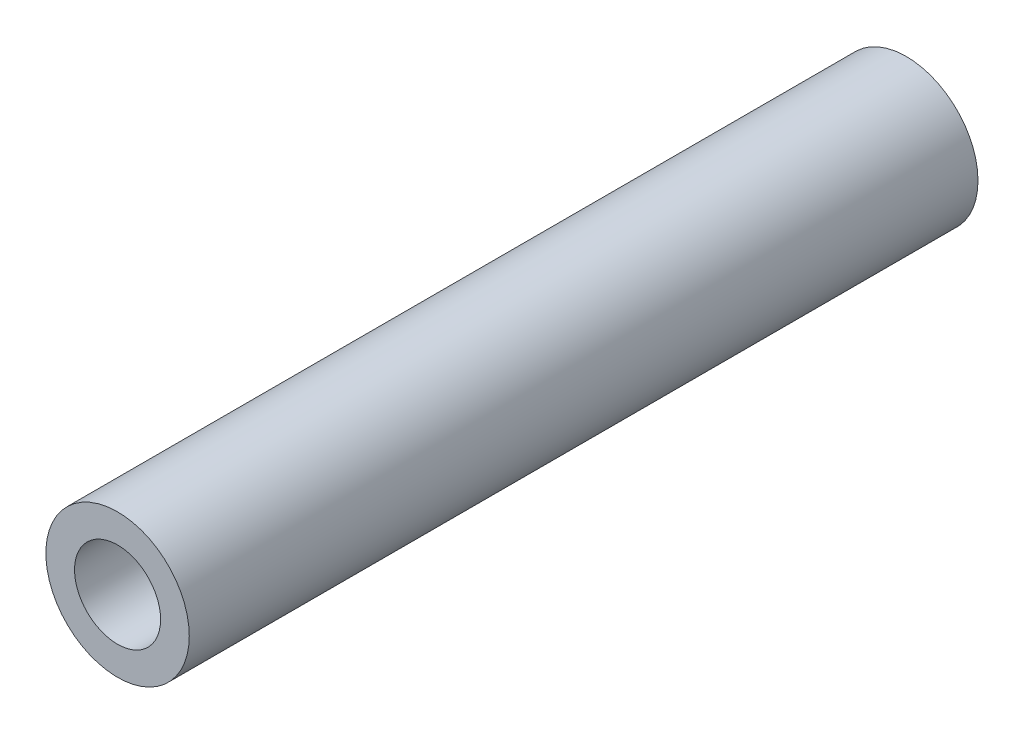
ISO-10303-21;
HEADER;
FILE_DESCRIPTION(('STEP AP214'),'2;1');
FILE_NAME('part.step','',(''),(''),'','','');
FILE_SCHEMA(('AUTOMOTIVE_DESIGN { 1 0 10303 214 1 1 1 1 }'));
ENDSEC;
DATA;
#1=APPLICATION_CONTEXT('core data for automotive mechanical design processes');
#2=APPLICATION_PROTOCOL_DEFINITION('international standard','automotive_design',2000,#1);
#3=PRODUCT_CONTEXT('',#1,'mechanical');
#4=PRODUCT('Part','Part','',(#3));
#5=PRODUCT_RELATED_PRODUCT_CATEGORY('part','',(#4));
#6=PRODUCT_DEFINITION_FORMATION('','',#4);
#7=PRODUCT_DEFINITION_CONTEXT('part definition',#1,'design');
#8=PRODUCT_DEFINITION('design','',#6,#7);
#9=PRODUCT_DEFINITION_SHAPE('','',#8);
#10=(LENGTH_UNIT() NAMED_UNIT(*) SI_UNIT(.MILLI.,.METRE.));
#11=(NAMED_UNIT(*) PLANE_ANGLE_UNIT() SI_UNIT($,.RADIAN.));
#12=(NAMED_UNIT(*) SI_UNIT($,.STERADIAN.) SOLID_ANGLE_UNIT());
#13=UNCERTAINTY_MEASURE_WITH_UNIT(LENGTH_MEASURE(1.E-05),#10,'distance_accuracy_value','');
#14=(GEOMETRIC_REPRESENTATION_CONTEXT(3) GLOBAL_UNCERTAINTY_ASSIGNED_CONTEXT((#13)) GLOBAL_UNIT_ASSIGNED_CONTEXT((#10,
#11,#12)) REPRESENTATION_CONTEXT('',''));
#15=CARTESIAN_POINT('',(0.,0.,0.));
#16=DIRECTION('',(0.,0.,1.));
#17=DIRECTION('',(1.,0.,0.));
#18=AXIS2_PLACEMENT_3D('',#15,#16,#17);
#19=CARTESIAN_POINT('',(0.,0.,-2.5));
#20=DIRECTION('',(0.,0.,1.));
#21=DIRECTION('',(1.,0.,0.));
#22=AXIS2_PLACEMENT_3D('',#19,#20,#21);
#23=CYLINDRICAL_SURFACE('',#22,2.5);
#24=CARTESIAN_POINT('',(0.,0.,-2.5));
#25=DIRECTION('',(0.,0.,1.));
#26=DIRECTION('',(1.,0.,0.));
#27=AXIS2_PLACEMENT_3D('',#24,#25,#26);
#28=CIRCLE('',#27,2.5);
#29=CARTESIAN_POINT('',(2.5,0.,-2.5));
#30=VERTEX_POINT('',#29);
#31=EDGE_CURVE('E10',#30,#30,#28,.T.);
#32=ORIENTED_EDGE('',*,*,#31,.T.);
#33=EDGE_LOOP('',(#32));
#34=FACE_BOUND('',#33,.T.);
#35=CARTESIAN_POINT('',(0.,0.,25.));
#36=DIRECTION('',(0.,0.,1.));
#37=DIRECTION('',(1.,0.,0.));
#38=AXIS2_PLACEMENT_3D('',#35,#36,#37);
#39=CIRCLE('',#38,2.5);
#40=CARTESIAN_POINT('',(2.5,0.,25.));
#41=VERTEX_POINT('',#40);
#42=EDGE_CURVE('E43',#41,#41,#39,.T.);
#43=ORIENTED_EDGE('',*,*,#42,.F.);
#44=EDGE_LOOP('',(#43));
#45=FACE_BOUND('',#44,.T.);
#46=ADVANCED_FACE('F37',(#34,#45),#23,.T.);
#47=CARTESIAN_POINT('',(0.,0.,-2.5));
#48=DIRECTION('',(0.,0.,1.));
#49=DIRECTION('',(1.,0.,0.));
#50=AXIS2_PLACEMENT_3D('',#47,#48,#49);
#51=PLANE('',#50);
#52=CARTESIAN_POINT('',(0.,0.,-2.5));
#53=DIRECTION('',(0.,0.,-1.));
#54=DIRECTION('',(-1.,0.,0.));
#55=AXIS2_PLACEMENT_3D('',#52,#53,#54);
#56=CIRCLE('',#55,1.5);
#57=CARTESIAN_POINT('',(-1.5,0.,-2.5));
#58=VERTEX_POINT('',#57);
#59=EDGE_CURVE('E51',#58,#58,#56,.T.);
#60=ORIENTED_EDGE('',*,*,#59,.F.);
#61=EDGE_LOOP('',(#60));
#62=FACE_BOUND('',#61,.T.);
#63=ORIENTED_EDGE('',*,*,#31,.F.);
#64=EDGE_LOOP('',(#63));
#65=FACE_BOUND('',#64,.T.);
#66=ADVANCED_FACE('F75',(#62,#65),#51,.F.);
#67=CARTESIAN_POINT('',(0.,0.,25.));
#68=DIRECTION('',(0.,0.,1.));
#69=DIRECTION('',(1.,0.,0.));
#70=AXIS2_PLACEMENT_3D('',#67,#68,#69);
#71=PLANE('',#70);
#72=CARTESIAN_POINT('',(0.,0.,25.));
#73=DIRECTION('',(0.,0.,1.));
#74=DIRECTION('',(1.,0.,0.));
#75=AXIS2_PLACEMENT_3D('',#72,#73,#74);
#76=CIRCLE('',#75,1.5);
#77=CARTESIAN_POINT('',(1.5,0.,25.));
#78=VERTEX_POINT('',#77);
#79=EDGE_CURVE('E57',#78,#78,#76,.T.);
#80=ORIENTED_EDGE('',*,*,#79,.F.);
#81=EDGE_LOOP('',(#80));
#82=FACE_BOUND('',#81,.T.);
#83=ORIENTED_EDGE('',*,*,#42,.T.);
#84=EDGE_LOOP('',(#83));
#85=FACE_BOUND('',#84,.T.);
#86=ADVANCED_FACE('F72',(#82,#85),#71,.T.);
#87=CARTESIAN_POINT('',(0.,0.,3.5));
#88=DIRECTION('',(0.,0.,-1.));
#89=DIRECTION('',(-1.,0.,0.));
#90=AXIS2_PLACEMENT_3D('',#87,#88,#89);
#91=CYLINDRICAL_SURFACE('',#90,1.5);
#92=CARTESIAN_POINT('',(0.,0.,3.5));
#93=DIRECTION('',(0.,0.,-1.));
#94=DIRECTION('',(-1.,0.,0.));
#95=AXIS2_PLACEMENT_3D('',#92,#93,#94);
#96=CIRCLE('',#95,1.5);
#97=CARTESIAN_POINT('',(-1.5,0.,3.5));
#98=VERTEX_POINT('',#97);
#99=EDGE_CURVE('E47',#98,#98,#96,.T.);
#100=ORIENTED_EDGE('',*,*,#99,.F.);
#101=EDGE_LOOP('',(#100));
#102=FACE_BOUND('',#101,.T.);
#103=ORIENTED_EDGE('',*,*,#59,.T.);
#104=EDGE_LOOP('',(#103));
#105=FACE_BOUND('',#104,.T.);
#106=ADVANCED_FACE('F74',(#102,#105),#91,.F.);
#107=CARTESIAN_POINT('',(0.,0.,3.5));
#108=DIRECTION('',(0.,0.,-1.));
#109=DIRECTION('',(-1.,0.,0.));
#110=AXIS2_PLACEMENT_3D('',#107,#108,#109);
#111=PLANE('',#110);
#112=ORIENTED_EDGE('',*,*,#99,.T.);
#113=EDGE_LOOP('',(#112));
#114=FACE_BOUND('',#113,.T.);
#115=ADVANCED_FACE('F68',(#114),#111,.T.);
#116=CARTESIAN_POINT('',(0.,0.,19.));
#117=DIRECTION('',(0.,0.,1.));
#118=DIRECTION('',(1.,0.,0.));
#119=AXIS2_PLACEMENT_3D('',#116,#117,#118);
#120=CYLINDRICAL_SURFACE('',#119,1.5);
#121=CARTESIAN_POINT('',(0.,0.,19.));
#122=DIRECTION('',(0.,0.,1.));
#123=DIRECTION('',(1.,0.,0.));
#124=AXIS2_PLACEMENT_3D('',#121,#122,#123);
#125=CIRCLE('',#124,1.5);
#126=CARTESIAN_POINT('',(1.5,0.,19.));
#127=VERTEX_POINT('',#126);
#128=EDGE_CURVE('E55',#127,#127,#125,.T.);
#129=ORIENTED_EDGE('',*,*,#128,.F.);
#130=EDGE_LOOP('',(#129));
#131=FACE_BOUND('',#130,.T.);
#132=ORIENTED_EDGE('',*,*,#79,.T.);
#133=EDGE_LOOP('',(#132));
#134=FACE_BOUND('',#133,.T.);
#135=ADVANCED_FACE('F65',(#131,#134),#120,.F.);
#136=CARTESIAN_POINT('',(0.,0.,19.));
#137=DIRECTION('',(0.,0.,1.));
#138=DIRECTION('',(1.,0.,0.));
#139=AXIS2_PLACEMENT_3D('',#136,#137,#138);
#140=PLANE('',#139);
#141=ORIENTED_EDGE('',*,*,#128,.T.);
#142=EDGE_LOOP('',(#141));
#143=FACE_BOUND('',#142,.T.);
#144=ADVANCED_FACE('F63',(#143),#140,.T.);
#145=CLOSED_SHELL('',(#46,#66,#86,#106,#115,#135,#144));
#146=MANIFOLD_SOLID_BREP('B2',#145);
#147=ADVANCED_BREP_SHAPE_REPRESENTATION('',(#18,#146),#14);
#148=SHAPE_DEFINITION_REPRESENTATION(#9,#147);
ENDSEC;
END-ISO-10303-21;
